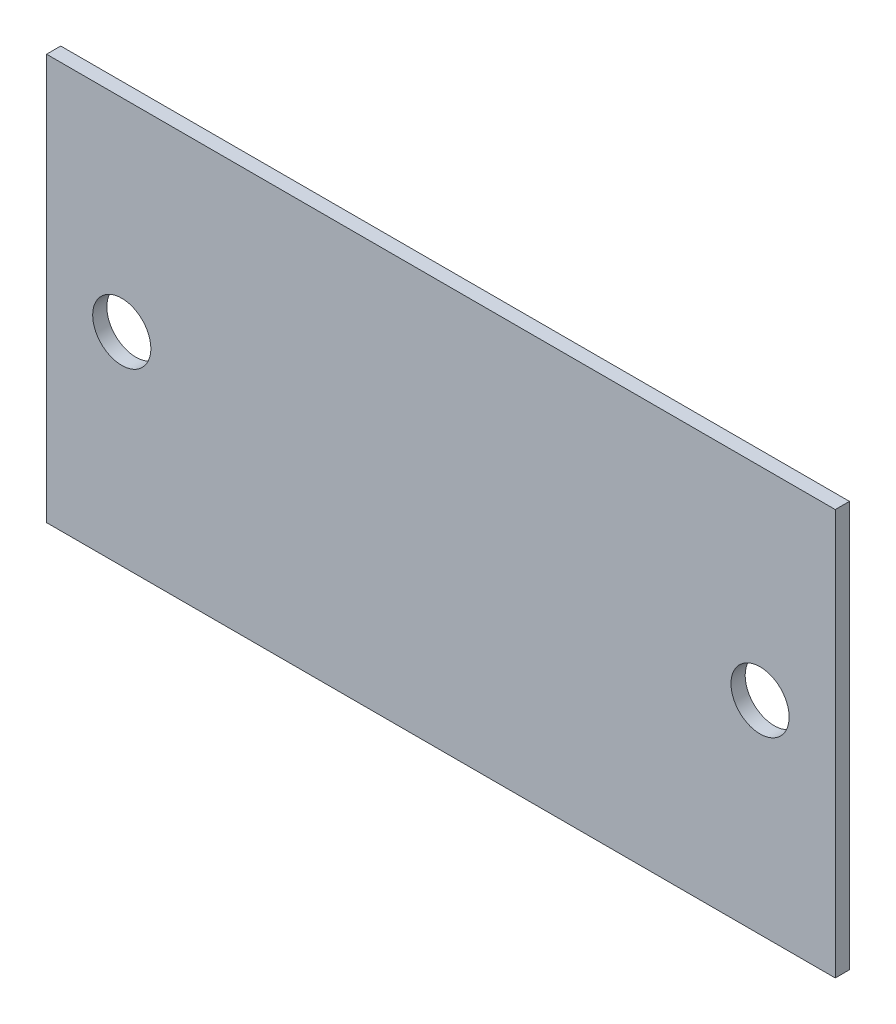
ISO-10303-21;
HEADER;
FILE_DESCRIPTION(('STEP AP214'),'2;1');
FILE_NAME('part.step','',(''),(''),'','','');
FILE_SCHEMA(('AUTOMOTIVE_DESIGN { 1 0 10303 214 1 1 1 1 }'));
ENDSEC;
DATA;
#1=APPLICATION_CONTEXT('core data for automotive mechanical design processes');
#2=APPLICATION_PROTOCOL_DEFINITION('international standard','automotive_design',2000,#1);
#3=PRODUCT_CONTEXT('',#1,'mechanical');
#4=PRODUCT('Part','Part','',(#3));
#5=PRODUCT_RELATED_PRODUCT_CATEGORY('part','',(#4));
#6=PRODUCT_DEFINITION_FORMATION('','',#4);
#7=PRODUCT_DEFINITION_CONTEXT('part definition',#1,'design');
#8=PRODUCT_DEFINITION('design','',#6,#7);
#9=PRODUCT_DEFINITION_SHAPE('','',#8);
#10=(LENGTH_UNIT() NAMED_UNIT(*) SI_UNIT(.MILLI.,.METRE.));
#11=(NAMED_UNIT(*) PLANE_ANGLE_UNIT() SI_UNIT($,.RADIAN.));
#12=(NAMED_UNIT(*) SI_UNIT($,.STERADIAN.) SOLID_ANGLE_UNIT());
#13=UNCERTAINTY_MEASURE_WITH_UNIT(LENGTH_MEASURE(1.E-05),#10,'distance_accuracy_value','');
#14=(GEOMETRIC_REPRESENTATION_CONTEXT(3) GLOBAL_UNCERTAINTY_ASSIGNED_CONTEXT((#13)) GLOBAL_UNIT_ASSIGNED_CONTEXT((#10,
#11,#12)) REPRESENTATION_CONTEXT('',''));
#15=CARTESIAN_POINT('',(0.,0.,0.));
#16=DIRECTION('',(0.,0.,1.));
#17=DIRECTION('',(1.,0.,0.));
#18=AXIS2_PLACEMENT_3D('',#15,#16,#17);
#19=CARTESIAN_POINT('',(0.,0.,-38.));
#20=DIRECTION('',(0.,0.,-1.));
#21=DIRECTION('',(-1.,0.,0.));
#22=AXIS2_PLACEMENT_3D('',#19,#20,#21);
#23=PLANE('',#22);
#24=CARTESIAN_POINT('',(22.5,107.87276797491,-38.));
#25=DIRECTION('',(0.,0.,-1.));
#26=DIRECTION('',(-1.,0.,0.));
#27=AXIS2_PLACEMENT_3D('',#24,#25,#26);
#28=CIRCLE('',#27,2.05);
#29=CARTESIAN_POINT('',(20.45,107.87276797491,-38.));
#30=VERTEX_POINT('',#29);
#31=EDGE_CURVE('E108',#30,#30,#28,.T.);
#32=ORIENTED_EDGE('',*,*,#31,.F.);
#33=EDGE_LOOP('',(#32));
#34=FACE_BOUND('',#33,.T.);
#35=DIRECTION('',(1.,0.,0.));
#36=VECTOR('',#35,1.);
#37=CARTESIAN_POINT('',(-27.8,122.17276797491,-38.));
#38=LINE('',#37,#36);
#39=CARTESIAN_POINT('',(-27.8,122.17276797491,-38.));
#40=VERTEX_POINT('',#39);
#41=CARTESIAN_POINT('',(27.8,122.17276797491,-38.));
#42=VERTEX_POINT('',#41);
#43=EDGE_CURVE('E93',#40,#42,#38,.T.);
#44=ORIENTED_EDGE('',*,*,#43,.T.);
#45=DIRECTION('',(0.,-1.,0.));
#46=VECTOR('',#45,1.);
#47=CARTESIAN_POINT('',(27.8,122.17276797491,-38.));
#48=LINE('',#47,#46);
#49=CARTESIAN_POINT('',(27.8,93.5727679749105,-38.));
#50=VERTEX_POINT('',#49);
#51=EDGE_CURVE('E88',#42,#50,#48,.T.);
#52=ORIENTED_EDGE('',*,*,#51,.T.);
#53=DIRECTION('',(-1.,0.,0.));
#54=VECTOR('',#53,1.);
#55=CARTESIAN_POINT('',(27.8,93.5727679749105,-38.));
#56=LINE('',#55,#54);
#57=CARTESIAN_POINT('',(-27.8,93.5727679749105,-38.));
#58=VERTEX_POINT('',#57);
#59=EDGE_CURVE('E91',#50,#58,#56,.T.);
#60=ORIENTED_EDGE('',*,*,#59,.T.);
#61=DIRECTION('',(0.,1.,0.));
#62=VECTOR('',#61,1.);
#63=CARTESIAN_POINT('',(-27.8,93.5727679749105,-38.));
#64=LINE('',#63,#62);
#65=EDGE_CURVE('E58',#58,#40,#64,.T.);
#66=ORIENTED_EDGE('',*,*,#65,.T.);
#67=EDGE_LOOP('',(#44,#52,#60,#66));
#68=FACE_BOUND('',#67,.T.);
#69=CARTESIAN_POINT('',(-22.5,107.87276797491,-38.));
#70=DIRECTION('',(0.,0.,-1.));
#71=DIRECTION('',(-1.,0.,0.));
#72=AXIS2_PLACEMENT_3D('',#69,#70,#71);
#73=CIRCLE('',#72,2.05);
#74=CARTESIAN_POINT('',(-24.55,107.87276797491,-38.));
#75=VERTEX_POINT('',#74);
#76=EDGE_CURVE('E123',#75,#75,#73,.T.);
#77=ORIENTED_EDGE('',*,*,#76,.F.);
#78=EDGE_LOOP('',(#77));
#79=FACE_BOUND('',#78,.T.);
#80=ADVANCED_FACE('F41',(#34,#68,#79),#23,.T.);
#81=CARTESIAN_POINT('',(0.,0.,-37.));
#82=DIRECTION('',(0.,0.,-1.));
#83=DIRECTION('',(-1.,0.,0.));
#84=AXIS2_PLACEMENT_3D('',#81,#82,#83);
#85=PLANE('',#84);
#86=DIRECTION('',(1.,0.,0.));
#87=VECTOR('',#86,1.);
#88=CARTESIAN_POINT('',(-27.8,122.17276797491,-37.));
#89=LINE('',#88,#87);
#90=CARTESIAN_POINT('',(-27.8,122.17276797491,-37.));
#91=VERTEX_POINT('',#90);
#92=CARTESIAN_POINT('',(27.8,122.17276797491,-37.));
#93=VERTEX_POINT('',#92);
#94=EDGE_CURVE('E105',#91,#93,#89,.T.);
#95=ORIENTED_EDGE('',*,*,#94,.F.);
#96=DIRECTION('',(0.,1.,0.));
#97=VECTOR('',#96,1.);
#98=CARTESIAN_POINT('',(-27.8,93.5727679749105,-37.));
#99=LINE('',#98,#97);
#100=CARTESIAN_POINT('',(-27.8,93.5727679749105,-37.));
#101=VERTEX_POINT('',#100);
#102=EDGE_CURVE('E81',#101,#91,#99,.T.);
#103=ORIENTED_EDGE('',*,*,#102,.F.);
#104=DIRECTION('',(-1.,0.,0.));
#105=VECTOR('',#104,1.);
#106=CARTESIAN_POINT('',(27.8,93.5727679749105,-37.));
#107=LINE('',#106,#105);
#108=CARTESIAN_POINT('',(27.8,93.5727679749105,-37.));
#109=VERTEX_POINT('',#108);
#110=EDGE_CURVE('E75',#109,#101,#107,.T.);
#111=ORIENTED_EDGE('',*,*,#110,.F.);
#112=DIRECTION('',(0.,-1.,0.));
#113=VECTOR('',#112,1.);
#114=CARTESIAN_POINT('',(27.8,122.17276797491,-37.));
#115=LINE('',#114,#113);
#116=EDGE_CURVE('E97',#93,#109,#115,.T.);
#117=ORIENTED_EDGE('',*,*,#116,.F.);
#118=EDGE_LOOP('',(#95,#103,#111,#117));
#119=FACE_BOUND('',#118,.T.);
#120=CARTESIAN_POINT('',(22.5,107.87276797491,-37.));
#121=DIRECTION('',(0.,0.,-1.));
#122=DIRECTION('',(-1.,0.,0.));
#123=AXIS2_PLACEMENT_3D('',#120,#121,#122);
#124=CIRCLE('',#123,2.05);
#125=CARTESIAN_POINT('',(20.45,107.87276797491,-37.));
#126=VERTEX_POINT('',#125);
#127=EDGE_CURVE('E120',#126,#126,#124,.T.);
#128=ORIENTED_EDGE('',*,*,#127,.T.);
#129=EDGE_LOOP('',(#128));
#130=FACE_BOUND('',#129,.T.);
#131=CARTESIAN_POINT('',(-22.5,107.87276797491,-37.));
#132=DIRECTION('',(0.,0.,-1.));
#133=DIRECTION('',(-1.,0.,0.));
#134=AXIS2_PLACEMENT_3D('',#131,#132,#133);
#135=CIRCLE('',#134,2.05);
#136=CARTESIAN_POINT('',(-24.55,107.87276797491,-37.));
#137=VERTEX_POINT('',#136);
#138=EDGE_CURVE('E126',#137,#137,#135,.T.);
#139=ORIENTED_EDGE('',*,*,#138,.T.);
#140=EDGE_LOOP('',(#139));
#141=FACE_BOUND('',#140,.T.);
#142=ADVANCED_FACE('F116',(#119,#130,#141),#85,.F.);
#143=CARTESIAN_POINT('',(-27.8,122.17276797491,-38.));
#144=DIRECTION('',(0.,-1.,0.));
#145=DIRECTION('',(0.,0.,-1.));
#146=AXIS2_PLACEMENT_3D('',#143,#144,#145);
#147=PLANE('',#146);
#148=ORIENTED_EDGE('',*,*,#94,.T.);
#149=DIRECTION('',(0.,0.,1.));
#150=VECTOR('',#149,1.);
#151=CARTESIAN_POINT('',(27.8,122.17276797491,-38.));
#152=LINE('',#151,#150);
#153=EDGE_CURVE('E11',#42,#93,#152,.T.);
#154=ORIENTED_EDGE('',*,*,#153,.F.);
#155=ORIENTED_EDGE('',*,*,#43,.F.);
#156=DIRECTION('',(0.,0.,1.));
#157=VECTOR('',#156,1.);
#158=CARTESIAN_POINT('',(-27.8,122.17276797491,-38.));
#159=LINE('',#158,#157);
#160=EDGE_CURVE('E101',#40,#91,#159,.T.);
#161=ORIENTED_EDGE('',*,*,#160,.T.);
#162=EDGE_LOOP('',(#148,#154,#155,#161));
#163=FACE_BOUND('',#162,.T.);
#164=ADVANCED_FACE('F43',(#163),#147,.F.);
#165=CARTESIAN_POINT('',(27.8,122.17276797491,-38.));
#166=DIRECTION('',(-1.,0.,0.));
#167=DIRECTION('',(0.,-1.,0.));
#168=AXIS2_PLACEMENT_3D('',#165,#166,#167);
#169=PLANE('',#168);
#170=ORIENTED_EDGE('',*,*,#116,.T.);
#171=DIRECTION('',(0.,0.,1.));
#172=VECTOR('',#171,1.);
#173=CARTESIAN_POINT('',(27.8,93.5727679749105,-38.));
#174=LINE('',#173,#172);
#175=EDGE_CURVE('E50',#50,#109,#174,.T.);
#176=ORIENTED_EDGE('',*,*,#175,.F.);
#177=ORIENTED_EDGE('',*,*,#51,.F.);
#178=ORIENTED_EDGE('',*,*,#153,.T.);
#179=EDGE_LOOP('',(#170,#176,#177,#178));
#180=FACE_BOUND('',#179,.T.);
#181=ADVANCED_FACE('F96',(#180),#169,.F.);
#182=CARTESIAN_POINT('',(27.8,93.5727679749105,-38.));
#183=DIRECTION('',(0.,1.,0.));
#184=DIRECTION('',(0.,0.,1.));
#185=AXIS2_PLACEMENT_3D('',#182,#183,#184);
#186=PLANE('',#185);
#187=ORIENTED_EDGE('',*,*,#110,.T.);
#188=DIRECTION('',(0.,0.,1.));
#189=VECTOR('',#188,1.);
#190=CARTESIAN_POINT('',(-27.8,93.5727679749105,-38.));
#191=LINE('',#190,#189);
#192=EDGE_CURVE('E98',#58,#101,#191,.T.);
#193=ORIENTED_EDGE('',*,*,#192,.F.);
#194=ORIENTED_EDGE('',*,*,#59,.F.);
#195=ORIENTED_EDGE('',*,*,#175,.T.);
#196=EDGE_LOOP('',(#187,#193,#194,#195));
#197=FACE_BOUND('',#196,.T.);
#198=ADVANCED_FACE('F99',(#197),#186,.F.);
#199=CARTESIAN_POINT('',(-27.8,93.5727679749105,-38.));
#200=DIRECTION('',(1.,0.,0.));
#201=DIRECTION('',(0.,1.,0.));
#202=AXIS2_PLACEMENT_3D('',#199,#200,#201);
#203=PLANE('',#202);
#204=ORIENTED_EDGE('',*,*,#102,.T.);
#205=ORIENTED_EDGE('',*,*,#160,.F.);
#206=ORIENTED_EDGE('',*,*,#65,.F.);
#207=ORIENTED_EDGE('',*,*,#192,.T.);
#208=EDGE_LOOP('',(#204,#205,#206,#207));
#209=FACE_BOUND('',#208,.T.);
#210=ADVANCED_FACE('F113',(#209),#203,.F.);
#211=CARTESIAN_POINT('',(22.5,107.87276797491,-38.));
#212=DIRECTION('',(0.,0.,1.));
#213=DIRECTION('',(1.,0.,0.));
#214=AXIS2_PLACEMENT_3D('',#211,#212,#213);
#215=CYLINDRICAL_SURFACE('',#214,2.05);
#216=ORIENTED_EDGE('',*,*,#31,.T.);
#217=EDGE_LOOP('',(#216));
#218=FACE_BOUND('',#217,.T.);
#219=ORIENTED_EDGE('',*,*,#127,.F.);
#220=EDGE_LOOP('',(#219));
#221=FACE_BOUND('',#220,.T.);
#222=ADVANCED_FACE('F143',(#218,#221),#215,.F.);
#223=CARTESIAN_POINT('',(-22.5,107.87276797491,-38.));
#224=DIRECTION('',(0.,0.,1.));
#225=DIRECTION('',(1.,0.,0.));
#226=AXIS2_PLACEMENT_3D('',#223,#224,#225);
#227=CYLINDRICAL_SURFACE('',#226,2.05);
#228=ORIENTED_EDGE('',*,*,#76,.T.);
#229=EDGE_LOOP('',(#228));
#230=FACE_BOUND('',#229,.T.);
#231=ORIENTED_EDGE('',*,*,#138,.F.);
#232=EDGE_LOOP('',(#231));
#233=FACE_BOUND('',#232,.T.);
#234=ADVANCED_FACE('F132',(#230,#233),#227,.F.);
#235=CLOSED_SHELL('',(#80,#142,#164,#181,#198,#210,#222,#234));
#236=MANIFOLD_SOLID_BREP('B2',#235);
#237=ADVANCED_BREP_SHAPE_REPRESENTATION('',(#18,#236),#14);
#238=SHAPE_DEFINITION_REPRESENTATION(#9,#237);
ENDSEC;
END-ISO-10303-21;
